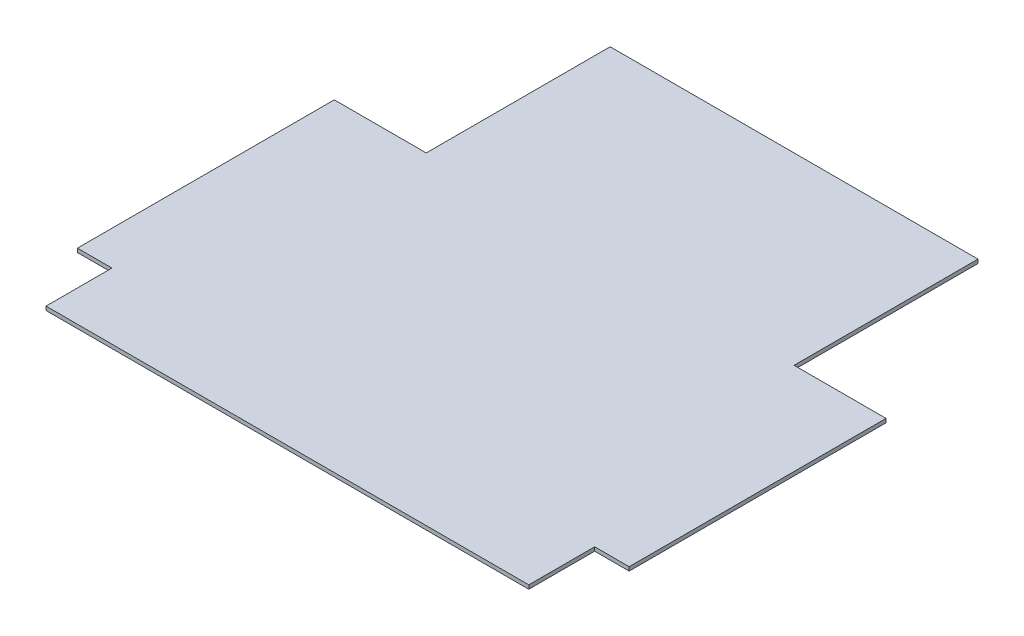
ISO-10303-21;
HEADER;
FILE_DESCRIPTION(('STEP AP214'),'2;1');
FILE_NAME('part.step','',(''),(''),'','','');
FILE_SCHEMA(('AUTOMOTIVE_DESIGN { 1 0 10303 214 1 1 1 1 }'));
ENDSEC;
DATA;
#1=APPLICATION_CONTEXT('core data for automotive mechanical design processes');
#2=APPLICATION_PROTOCOL_DEFINITION('international standard','automotive_design',2000,#1);
#3=PRODUCT_CONTEXT('',#1,'mechanical');
#4=PRODUCT('Part','Part','',(#3));
#5=PRODUCT_RELATED_PRODUCT_CATEGORY('part','',(#4));
#6=PRODUCT_DEFINITION_FORMATION('','',#4);
#7=PRODUCT_DEFINITION_CONTEXT('part definition',#1,'design');
#8=PRODUCT_DEFINITION('design','',#6,#7);
#9=PRODUCT_DEFINITION_SHAPE('','',#8);
#10=(LENGTH_UNIT() NAMED_UNIT(*) SI_UNIT(.MILLI.,.METRE.));
#11=(NAMED_UNIT(*) PLANE_ANGLE_UNIT() SI_UNIT($,.RADIAN.));
#12=(NAMED_UNIT(*) SI_UNIT($,.STERADIAN.) SOLID_ANGLE_UNIT());
#13=UNCERTAINTY_MEASURE_WITH_UNIT(LENGTH_MEASURE(1.E-05),#10,'distance_accuracy_value','');
#14=(GEOMETRIC_REPRESENTATION_CONTEXT(3) GLOBAL_UNCERTAINTY_ASSIGNED_CONTEXT((#13)) GLOBAL_UNIT_ASSIGNED_CONTEXT((#10,
#11,#12)) REPRESENTATION_CONTEXT('',''));
#15=CARTESIAN_POINT('',(0.,0.,0.));
#16=DIRECTION('',(0.,0.,1.));
#17=DIRECTION('',(1.,0.,0.));
#18=AXIS2_PLACEMENT_3D('',#15,#16,#17);
#19=CARTESIAN_POINT('',(0.,3.175,0.));
#20=DIRECTION('',(1.,0.,0.));
#21=DIRECTION('',(0.,0.,-1.));
#22=AXIS2_PLACEMENT_3D('',#19,#20,#21);
#23=PLANE('',#22);
#24=DIRECTION('',(0.,0.,1.));
#25=VECTOR('',#24,1.);
#26=CARTESIAN_POINT('',(0.,0.,0.));
#27=LINE('',#26,#25);
#28=CARTESIAN_POINT('',(0.,0.,-212.852));
#29=VERTEX_POINT('',#28);
#30=CARTESIAN_POINT('',(0.,0.,0.));
#31=VERTEX_POINT('',#30);
#32=EDGE_CURVE('E152',#29,#31,#27,.T.);
#33=ORIENTED_EDGE('',*,*,#32,.T.);
#34=DIRECTION('',(0.,-1.,0.));
#35=VECTOR('',#34,1.);
#36=CARTESIAN_POINT('',(0.,3.175,0.));
#37=LINE('',#36,#35);
#38=CARTESIAN_POINT('',(0.,3.175,0.));
#39=VERTEX_POINT('',#38);
#40=EDGE_CURVE('E11',#39,#31,#37,.T.);
#41=ORIENTED_EDGE('',*,*,#40,.F.);
#42=DIRECTION('',(0.,0.,1.));
#43=VECTOR('',#42,1.);
#44=CARTESIAN_POINT('',(0.,3.175,0.));
#45=LINE('',#44,#43);
#46=CARTESIAN_POINT('',(0.,3.175,-212.852));
#47=VERTEX_POINT('',#46);
#48=EDGE_CURVE('E174',#47,#39,#45,.T.);
#49=ORIENTED_EDGE('',*,*,#48,.F.);
#50=DIRECTION('',(0.,-1.,0.));
#51=VECTOR('',#50,1.);
#52=CARTESIAN_POINT('',(0.,3.175,-212.852));
#53=LINE('',#52,#51);
#54=EDGE_CURVE('E148',#47,#29,#53,.T.);
#55=ORIENTED_EDGE('',*,*,#54,.T.);
#56=EDGE_LOOP('',(#33,#41,#49,#55));
#57=FACE_BOUND('',#56,.T.);
#58=ADVANCED_FACE('F32',(#57),#23,.F.);
#59=CARTESIAN_POINT('',(0.,3.175,0.));
#60=DIRECTION('',(0.,0.,-1.));
#61=DIRECTION('',(-1.,0.,0.));
#62=AXIS2_PLACEMENT_3D('',#59,#60,#61);
#63=PLANE('',#62);
#64=DIRECTION('',(1.,0.,0.));
#65=VECTOR('',#64,1.);
#66=CARTESIAN_POINT('',(0.,0.,0.));
#67=LINE('',#66,#65);
#68=CARTESIAN_POINT('',(28.575,0.,0.));
#69=VERTEX_POINT('',#68);
#70=EDGE_CURVE('E155',#31,#69,#67,.T.);
#71=ORIENTED_EDGE('',*,*,#70,.T.);
#72=DIRECTION('',(0.,-1.,0.));
#73=VECTOR('',#72,1.);
#74=CARTESIAN_POINT('',(28.575,3.175,0.));
#75=LINE('',#74,#73);
#76=CARTESIAN_POINT('',(28.575,3.175,0.));
#77=VERTEX_POINT('',#76);
#78=EDGE_CURVE('E40',#77,#69,#75,.T.);
#79=ORIENTED_EDGE('',*,*,#78,.F.);
#80=DIRECTION('',(1.,0.,0.));
#81=VECTOR('',#80,1.);
#82=CARTESIAN_POINT('',(0.,3.175,0.));
#83=LINE('',#82,#81);
#84=EDGE_CURVE('E103',#39,#77,#83,.T.);
#85=ORIENTED_EDGE('',*,*,#84,.F.);
#86=ORIENTED_EDGE('',*,*,#40,.T.);
#87=EDGE_LOOP('',(#71,#79,#85,#86));
#88=FACE_BOUND('',#87,.T.);
#89=ADVANCED_FACE('F252',(#88),#63,.F.);
#90=CARTESIAN_POINT('',(28.575,3.175,0.));
#91=DIRECTION('',(1.,0.,0.));
#92=DIRECTION('',(0.,0.,-1.));
#93=AXIS2_PLACEMENT_3D('',#90,#91,#92);
#94=PLANE('',#93);
#95=DIRECTION('',(0.,0.,1.));
#96=VECTOR('',#95,1.);
#97=CARTESIAN_POINT('',(28.575,0.,0.));
#98=LINE('',#97,#96);
#99=CARTESIAN_POINT('',(28.575,0.,54.61));
#100=VERTEX_POINT('',#99);
#101=EDGE_CURVE('E157',#69,#100,#98,.T.);
#102=ORIENTED_EDGE('',*,*,#101,.T.);
#103=DIRECTION('',(0.,-1.,0.));
#104=VECTOR('',#103,1.);
#105=CARTESIAN_POINT('',(28.575,3.175,54.61));
#106=LINE('',#105,#104);
#107=CARTESIAN_POINT('',(28.575,3.175,54.61));
#108=VERTEX_POINT('',#107);
#109=EDGE_CURVE('E193',#108,#100,#106,.T.);
#110=ORIENTED_EDGE('',*,*,#109,.F.);
#111=DIRECTION('',(0.,0.,1.));
#112=VECTOR('',#111,1.);
#113=CARTESIAN_POINT('',(28.575,3.175,0.));
#114=LINE('',#113,#112);
#115=EDGE_CURVE('E201',#77,#108,#114,.T.);
#116=ORIENTED_EDGE('',*,*,#115,.F.);
#117=ORIENTED_EDGE('',*,*,#78,.T.);
#118=EDGE_LOOP('',(#102,#110,#116,#117));
#119=FACE_BOUND('',#118,.T.);
#120=ADVANCED_FACE('F199',(#119),#94,.F.);
#121=CARTESIAN_POINT('',(28.575,3.175,54.61));
#122=DIRECTION('',(0.,0.,-1.));
#123=DIRECTION('',(-1.,0.,0.));
#124=AXIS2_PLACEMENT_3D('',#121,#122,#123);
#125=PLANE('',#124);
#126=DIRECTION('',(1.,0.,0.));
#127=VECTOR('',#126,1.);
#128=CARTESIAN_POINT('',(28.575,0.,54.61));
#129=LINE('',#128,#127);
#130=CARTESIAN_POINT('',(428.625,0.,54.61));
#131=VERTEX_POINT('',#130);
#132=EDGE_CURVE('E159',#100,#131,#129,.T.);
#133=ORIENTED_EDGE('',*,*,#132,.T.);
#134=DIRECTION('',(0.,-1.,0.));
#135=VECTOR('',#134,1.);
#136=CARTESIAN_POINT('',(428.625,3.175,54.61));
#137=LINE('',#136,#135);
#138=CARTESIAN_POINT('',(428.625,3.175,54.61));
#139=VERTEX_POINT('',#138);
#140=EDGE_CURVE('E190',#139,#131,#137,.T.);
#141=ORIENTED_EDGE('',*,*,#140,.F.);
#142=DIRECTION('',(1.,0.,0.));
#143=VECTOR('',#142,1.);
#144=CARTESIAN_POINT('',(28.575,3.175,54.61));
#145=LINE('',#144,#143);
#146=EDGE_CURVE('E219',#108,#139,#145,.T.);
#147=ORIENTED_EDGE('',*,*,#146,.F.);
#148=ORIENTED_EDGE('',*,*,#109,.T.);
#149=EDGE_LOOP('',(#133,#141,#147,#148));
#150=FACE_BOUND('',#149,.T.);
#151=ADVANCED_FACE('F210',(#150),#125,.F.);
#152=CARTESIAN_POINT('',(428.625,3.175,0.));
#153=DIRECTION('',(-1.,0.,0.));
#154=DIRECTION('',(0.,0.,1.));
#155=AXIS2_PLACEMENT_3D('',#152,#153,#154);
#156=PLANE('',#155);
#157=DIRECTION('',(0.,0.,-1.));
#158=VECTOR('',#157,1.);
#159=CARTESIAN_POINT('',(428.625,0.,0.));
#160=LINE('',#159,#158);
#161=CARTESIAN_POINT('',(428.625,0.,0.));
#162=VERTEX_POINT('',#161);
#163=EDGE_CURVE('E161',#131,#162,#160,.T.);
#164=ORIENTED_EDGE('',*,*,#163,.T.);
#165=DIRECTION('',(0.,-1.,0.));
#166=VECTOR('',#165,1.);
#167=CARTESIAN_POINT('',(428.625,3.175,0.));
#168=LINE('',#167,#166);
#169=CARTESIAN_POINT('',(428.625,3.175,0.));
#170=VERTEX_POINT('',#169);
#171=EDGE_CURVE('E187',#170,#162,#168,.T.);
#172=ORIENTED_EDGE('',*,*,#171,.F.);
#173=DIRECTION('',(0.,0.,-1.));
#174=VECTOR('',#173,1.);
#175=CARTESIAN_POINT('',(428.625,3.175,0.));
#176=LINE('',#175,#174);
#177=EDGE_CURVE('E216',#139,#170,#176,.T.);
#178=ORIENTED_EDGE('',*,*,#177,.F.);
#179=ORIENTED_EDGE('',*,*,#140,.T.);
#180=EDGE_LOOP('',(#164,#172,#178,#179));
#181=FACE_BOUND('',#180,.T.);
#182=ADVANCED_FACE('F214',(#181),#156,.F.);
#183=CARTESIAN_POINT('',(428.625,3.175,0.));
#184=DIRECTION('',(0.,0.,-1.));
#185=DIRECTION('',(-1.,0.,0.));
#186=AXIS2_PLACEMENT_3D('',#183,#184,#185);
#187=PLANE('',#186);
#188=DIRECTION('',(1.,0.,0.));
#189=VECTOR('',#188,1.);
#190=CARTESIAN_POINT('',(428.625,0.,0.));
#191=LINE('',#190,#189);
#192=CARTESIAN_POINT('',(457.2,0.,0.));
#193=VERTEX_POINT('',#192);
#194=EDGE_CURVE('E163',#162,#193,#191,.T.);
#195=ORIENTED_EDGE('',*,*,#194,.T.);
#196=DIRECTION('',(0.,-1.,0.));
#197=VECTOR('',#196,1.);
#198=CARTESIAN_POINT('',(457.2,3.175,0.));
#199=LINE('',#198,#197);
#200=CARTESIAN_POINT('',(457.2,3.175,0.));
#201=VERTEX_POINT('',#200);
#202=EDGE_CURVE('E184',#201,#193,#199,.T.);
#203=ORIENTED_EDGE('',*,*,#202,.F.);
#204=DIRECTION('',(1.,0.,0.));
#205=VECTOR('',#204,1.);
#206=CARTESIAN_POINT('',(428.625,3.175,0.));
#207=LINE('',#206,#205);
#208=EDGE_CURVE('E218',#170,#201,#207,.T.);
#209=ORIENTED_EDGE('',*,*,#208,.F.);
#210=ORIENTED_EDGE('',*,*,#171,.T.);
#211=EDGE_LOOP('',(#195,#203,#209,#210));
#212=FACE_BOUND('',#211,.T.);
#213=ADVANCED_FACE('F265',(#212),#187,.F.);
#214=CARTESIAN_POINT('',(457.2,3.175,0.));
#215=DIRECTION('',(-1.,0.,0.));
#216=DIRECTION('',(0.,0.,1.));
#217=AXIS2_PLACEMENT_3D('',#214,#215,#216);
#218=PLANE('',#217);
#219=DIRECTION('',(0.,0.,-1.));
#220=VECTOR('',#219,1.);
#221=CARTESIAN_POINT('',(457.2,0.,0.));
#222=LINE('',#221,#220);
#223=CARTESIAN_POINT('',(457.2,0.,-212.852));
#224=VERTEX_POINT('',#223);
#225=EDGE_CURVE('E165',#193,#224,#222,.T.);
#226=ORIENTED_EDGE('',*,*,#225,.T.);
#227=DIRECTION('',(0.,-1.,0.));
#228=VECTOR('',#227,1.);
#229=CARTESIAN_POINT('',(457.2,3.175,-212.852));
#230=LINE('',#229,#228);
#231=CARTESIAN_POINT('',(457.2,3.175,-212.852));
#232=VERTEX_POINT('',#231);
#233=EDGE_CURVE('E181',#232,#224,#230,.T.);
#234=ORIENTED_EDGE('',*,*,#233,.F.);
#235=DIRECTION('',(0.,0.,-1.));
#236=VECTOR('',#235,1.);
#237=CARTESIAN_POINT('',(457.2,3.175,0.));
#238=LINE('',#237,#236);
#239=EDGE_CURVE('E221',#201,#232,#238,.T.);
#240=ORIENTED_EDGE('',*,*,#239,.F.);
#241=ORIENTED_EDGE('',*,*,#202,.T.);
#242=EDGE_LOOP('',(#226,#234,#240,#241));
#243=FACE_BOUND('',#242,.T.);
#244=ADVANCED_FACE('F268',(#243),#218,.F.);
#245=CARTESIAN_POINT('',(381.,3.175,-212.852));
#246=DIRECTION('',(0.,0.,1.));
#247=DIRECTION('',(1.,0.,0.));
#248=AXIS2_PLACEMENT_3D('',#245,#246,#247);
#249=PLANE('',#248);
#250=DIRECTION('',(-1.,0.,0.));
#251=VECTOR('',#250,1.);
#252=CARTESIAN_POINT('',(381.,0.,-212.852));
#253=LINE('',#252,#251);
#254=CARTESIAN_POINT('',(381.,0.,-212.852));
#255=VERTEX_POINT('',#254);
#256=EDGE_CURVE('E167',#224,#255,#253,.T.);
#257=ORIENTED_EDGE('',*,*,#256,.T.);
#258=DIRECTION('',(0.,-1.,0.));
#259=VECTOR('',#258,1.);
#260=CARTESIAN_POINT('',(381.,3.175,-212.852));
#261=LINE('',#260,#259);
#262=CARTESIAN_POINT('',(381.,3.175,-212.852));
#263=VERTEX_POINT('',#262);
#264=EDGE_CURVE('E178',#263,#255,#261,.T.);
#265=ORIENTED_EDGE('',*,*,#264,.F.);
#266=DIRECTION('',(-1.,0.,0.));
#267=VECTOR('',#266,1.);
#268=CARTESIAN_POINT('',(381.,3.175,-212.852));
#269=LINE('',#268,#267);
#270=EDGE_CURVE('E227',#232,#263,#269,.T.);
#271=ORIENTED_EDGE('',*,*,#270,.F.);
#272=ORIENTED_EDGE('',*,*,#233,.T.);
#273=EDGE_LOOP('',(#257,#265,#271,#272));
#274=FACE_BOUND('',#273,.T.);
#275=ADVANCED_FACE('F233',(#274),#249,.F.);
#276=CARTESIAN_POINT('',(381.,3.175,-212.852));
#277=DIRECTION('',(-1.,0.,0.));
#278=DIRECTION('',(0.,0.,1.));
#279=AXIS2_PLACEMENT_3D('',#276,#277,#278);
#280=PLANE('',#279);
#281=DIRECTION('',(0.,0.,-1.));
#282=VECTOR('',#281,1.);
#283=CARTESIAN_POINT('',(381.,0.,-212.852));
#284=LINE('',#283,#282);
#285=CARTESIAN_POINT('',(381.,0.,-365.252));
#286=VERTEX_POINT('',#285);
#287=EDGE_CURVE('E169',#255,#286,#284,.T.);
#288=ORIENTED_EDGE('',*,*,#287,.T.);
#289=DIRECTION('',(0.,-1.,0.));
#290=VECTOR('',#289,1.);
#291=CARTESIAN_POINT('',(381.,3.175,-365.252));
#292=LINE('',#291,#290);
#293=CARTESIAN_POINT('',(381.,3.175,-365.252));
#294=VERTEX_POINT('',#293);
#295=EDGE_CURVE('E143',#294,#286,#292,.T.);
#296=ORIENTED_EDGE('',*,*,#295,.F.);
#297=DIRECTION('',(0.,0.,-1.));
#298=VECTOR('',#297,1.);
#299=CARTESIAN_POINT('',(381.,3.175,-212.852));
#300=LINE('',#299,#298);
#301=EDGE_CURVE('E134',#263,#294,#300,.T.);
#302=ORIENTED_EDGE('',*,*,#301,.F.);
#303=ORIENTED_EDGE('',*,*,#264,.T.);
#304=EDGE_LOOP('',(#288,#296,#302,#303));
#305=FACE_BOUND('',#304,.T.);
#306=ADVANCED_FACE('F237',(#305),#280,.F.);
#307=CARTESIAN_POINT('',(76.2,3.175,-365.252));
#308=DIRECTION('',(0.,0.,1.));
#309=DIRECTION('',(1.,0.,0.));
#310=AXIS2_PLACEMENT_3D('',#307,#308,#309);
#311=PLANE('',#310);
#312=DIRECTION('',(-1.,0.,0.));
#313=VECTOR('',#312,1.);
#314=CARTESIAN_POINT('',(76.2,0.,-365.252));
#315=LINE('',#314,#313);
#316=CARTESIAN_POINT('',(76.2,0.,-365.252));
#317=VERTEX_POINT('',#316);
#318=EDGE_CURVE('E142',#286,#317,#315,.T.);
#319=ORIENTED_EDGE('',*,*,#318,.T.);
#320=DIRECTION('',(0.,-1.,0.));
#321=VECTOR('',#320,1.);
#322=CARTESIAN_POINT('',(76.2,3.175,-365.252));
#323=LINE('',#322,#321);
#324=CARTESIAN_POINT('',(76.2,3.175,-365.252));
#325=VERTEX_POINT('',#324);
#326=EDGE_CURVE('E139',#325,#317,#323,.T.);
#327=ORIENTED_EDGE('',*,*,#326,.F.);
#328=DIRECTION('',(-1.,0.,0.));
#329=VECTOR('',#328,1.);
#330=CARTESIAN_POINT('',(76.2,3.175,-365.252));
#331=LINE('',#330,#329);
#332=EDGE_CURVE('E128',#294,#325,#331,.T.);
#333=ORIENTED_EDGE('',*,*,#332,.F.);
#334=ORIENTED_EDGE('',*,*,#295,.T.);
#335=EDGE_LOOP('',(#319,#327,#333,#334));
#336=FACE_BOUND('',#335,.T.);
#337=ADVANCED_FACE('F140',(#336),#311,.F.);
#338=CARTESIAN_POINT('',(76.2,3.175,-212.852));
#339=DIRECTION('',(1.,0.,0.));
#340=DIRECTION('',(0.,0.,-1.));
#341=AXIS2_PLACEMENT_3D('',#338,#339,#340);
#342=PLANE('',#341);
#343=DIRECTION('',(0.,0.,1.));
#344=VECTOR('',#343,1.);
#345=CARTESIAN_POINT('',(76.2,0.,-212.852));
#346=LINE('',#345,#344);
#347=CARTESIAN_POINT('',(76.2,0.,-212.852));
#348=VERTEX_POINT('',#347);
#349=EDGE_CURVE('E89',#317,#348,#346,.T.);
#350=ORIENTED_EDGE('',*,*,#349,.T.);
#351=DIRECTION('',(0.,-1.,0.));
#352=VECTOR('',#351,1.);
#353=CARTESIAN_POINT('',(76.2,3.175,-212.852));
#354=LINE('',#353,#352);
#355=CARTESIAN_POINT('',(76.2,3.175,-212.852));
#356=VERTEX_POINT('',#355);
#357=EDGE_CURVE('E144',#356,#348,#354,.T.);
#358=ORIENTED_EDGE('',*,*,#357,.F.);
#359=DIRECTION('',(0.,0.,1.));
#360=VECTOR('',#359,1.);
#361=CARTESIAN_POINT('',(76.2,3.175,-212.852));
#362=LINE('',#361,#360);
#363=EDGE_CURVE('E132',#325,#356,#362,.T.);
#364=ORIENTED_EDGE('',*,*,#363,.F.);
#365=ORIENTED_EDGE('',*,*,#326,.T.);
#366=EDGE_LOOP('',(#350,#358,#364,#365));
#367=FACE_BOUND('',#366,.T.);
#368=ADVANCED_FACE('F146',(#367),#342,.F.);
#369=CARTESIAN_POINT('',(0.,3.175,-212.852));
#370=DIRECTION('',(0.,0.,1.));
#371=DIRECTION('',(1.,0.,0.));
#372=AXIS2_PLACEMENT_3D('',#369,#370,#371);
#373=PLANE('',#372);
#374=DIRECTION('',(-1.,0.,0.));
#375=VECTOR('',#374,1.);
#376=CARTESIAN_POINT('',(0.,0.,-212.852));
#377=LINE('',#376,#375);
#378=EDGE_CURVE('E95',#348,#29,#377,.T.);
#379=ORIENTED_EDGE('',*,*,#378,.T.);
#380=ORIENTED_EDGE('',*,*,#54,.F.);
#381=DIRECTION('',(-1.,0.,0.));
#382=VECTOR('',#381,1.);
#383=CARTESIAN_POINT('',(0.,3.175,-212.852));
#384=LINE('',#383,#382);
#385=EDGE_CURVE('E48',#356,#47,#384,.T.);
#386=ORIENTED_EDGE('',*,*,#385,.F.);
#387=ORIENTED_EDGE('',*,*,#357,.T.);
#388=EDGE_LOOP('',(#379,#380,#386,#387));
#389=FACE_BOUND('',#388,.T.);
#390=ADVANCED_FACE('F241',(#389),#373,.F.);
#391=CARTESIAN_POINT('',(0.,3.175,0.));
#392=DIRECTION('',(0.,-1.,0.));
#393=DIRECTION('',(0.,0.,-1.));
#394=AXIS2_PLACEMENT_3D('',#391,#392,#393);
#395=PLANE('',#394);
#396=ORIENTED_EDGE('',*,*,#48,.T.);
#397=ORIENTED_EDGE('',*,*,#84,.T.);
#398=ORIENTED_EDGE('',*,*,#115,.T.);
#399=ORIENTED_EDGE('',*,*,#146,.T.);
#400=ORIENTED_EDGE('',*,*,#177,.T.);
#401=ORIENTED_EDGE('',*,*,#208,.T.);
#402=ORIENTED_EDGE('',*,*,#239,.T.);
#403=ORIENTED_EDGE('',*,*,#270,.T.);
#404=ORIENTED_EDGE('',*,*,#301,.T.);
#405=ORIENTED_EDGE('',*,*,#332,.T.);
#406=ORIENTED_EDGE('',*,*,#363,.T.);
#407=ORIENTED_EDGE('',*,*,#385,.T.);
#408=EDGE_LOOP('',(#396,#397,#398,#399,#400,#401,#402,#403,#404,#405,#406,#407));
#409=FACE_BOUND('',#408,.T.);
#410=ADVANCED_FACE('F130',(#409),#395,.F.);
#411=CARTESIAN_POINT('',(0.,0.,0.));
#412=DIRECTION('',(0.,-1.,0.));
#413=DIRECTION('',(0.,0.,-1.));
#414=AXIS2_PLACEMENT_3D('',#411,#412,#413);
#415=PLANE('',#414);
#416=ORIENTED_EDGE('',*,*,#32,.F.);
#417=ORIENTED_EDGE('',*,*,#378,.F.);
#418=ORIENTED_EDGE('',*,*,#349,.F.);
#419=ORIENTED_EDGE('',*,*,#318,.F.);
#420=ORIENTED_EDGE('',*,*,#287,.F.);
#421=ORIENTED_EDGE('',*,*,#256,.F.);
#422=ORIENTED_EDGE('',*,*,#225,.F.);
#423=ORIENTED_EDGE('',*,*,#194,.F.);
#424=ORIENTED_EDGE('',*,*,#163,.F.);
#425=ORIENTED_EDGE('',*,*,#132,.F.);
#426=ORIENTED_EDGE('',*,*,#101,.F.);
#427=ORIENTED_EDGE('',*,*,#70,.F.);
#428=EDGE_LOOP('',(#416,#417,#418,#419,#420,#421,#422,#423,#424,#425,#426,#427));
#429=FACE_BOUND('',#428,.T.);
#430=ADVANCED_FACE('F205',(#429),#415,.T.);
#431=CLOSED_SHELL('',(#58,#89,#120,#151,#182,#213,#244,#275,#306,#337,#368,#390,#410,#430));
#432=MANIFOLD_SOLID_BREP('B2',#431);
#433=ADVANCED_BREP_SHAPE_REPRESENTATION('',(#18,#432),#14);
#434=SHAPE_DEFINITION_REPRESENTATION(#9,#433);
ENDSEC;
END-ISO-10303-21;
